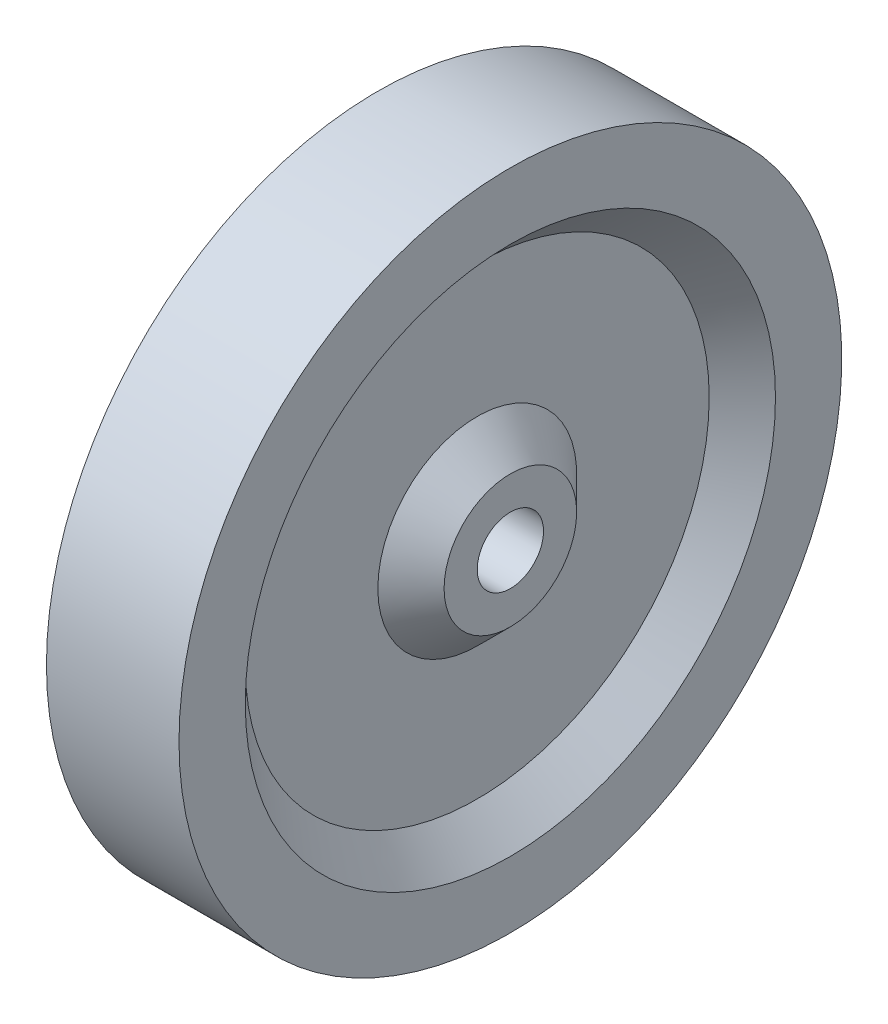
ISO-10303-21;
HEADER;
FILE_DESCRIPTION(('STEP AP214'),'2;1');
FILE_NAME('part.step','',(''),(''),'','','');
FILE_SCHEMA(('AUTOMOTIVE_DESIGN { 1 0 10303 214 1 1 1 1 }'));
ENDSEC;
DATA;
#1=APPLICATION_CONTEXT('core data for automotive mechanical design processes');
#2=APPLICATION_PROTOCOL_DEFINITION('international standard','automotive_design',2000,#1);
#3=PRODUCT_CONTEXT('',#1,'mechanical');
#4=PRODUCT('Part','Part','',(#3));
#5=PRODUCT_RELATED_PRODUCT_CATEGORY('part','',(#4));
#6=PRODUCT_DEFINITION_FORMATION('','',#4);
#7=PRODUCT_DEFINITION_CONTEXT('part definition',#1,'design');
#8=PRODUCT_DEFINITION('design','',#6,#7);
#9=PRODUCT_DEFINITION_SHAPE('','',#8);
#10=(LENGTH_UNIT() NAMED_UNIT(*) SI_UNIT(.MILLI.,.METRE.));
#11=(NAMED_UNIT(*) PLANE_ANGLE_UNIT() SI_UNIT($,.RADIAN.));
#12=(NAMED_UNIT(*) SI_UNIT($,.STERADIAN.) SOLID_ANGLE_UNIT());
#13=UNCERTAINTY_MEASURE_WITH_UNIT(LENGTH_MEASURE(1.E-05),#10,'distance_accuracy_value','');
#14=(GEOMETRIC_REPRESENTATION_CONTEXT(3) GLOBAL_UNCERTAINTY_ASSIGNED_CONTEXT((#13)) GLOBAL_UNIT_ASSIGNED_CONTEXT((#10,
#11,#12)) REPRESENTATION_CONTEXT('',''));
#15=CARTESIAN_POINT('',(0.,0.,0.));
#16=DIRECTION('',(0.,0.,1.));
#17=DIRECTION('',(1.,0.,0.));
#18=AXIS2_PLACEMENT_3D('',#15,#16,#17);
#19=CARTESIAN_POINT('',(-10.,0.,0.));
#20=DIRECTION('',(-1.,0.,0.));
#21=DIRECTION('',(0.,0.,1.));
#22=AXIS2_PLACEMENT_3D('',#19,#20,#21);
#23=CYLINDRICAL_SURFACE('',#22,50.);
#24=CARTESIAN_POINT('',(10.,0.,0.));
#25=DIRECTION('',(-1.,0.,0.));
#26=DIRECTION('',(0.,0.,1.));
#27=AXIS2_PLACEMENT_3D('',#24,#25,#26);
#28=CIRCLE('',#27,50.);
#29=CARTESIAN_POINT('',(10.,0.,50.));
#30=VERTEX_POINT('',#29);
#31=EDGE_CURVE('E67',#30,#30,#28,.T.);
#32=ORIENTED_EDGE('',*,*,#31,.T.);
#33=EDGE_LOOP('',(#32));
#34=FACE_BOUND('',#33,.T.);
#35=CARTESIAN_POINT('',(-10.,0.,0.));
#36=DIRECTION('',(-1.,0.,0.));
#37=DIRECTION('',(0.,0.,1.));
#38=AXIS2_PLACEMENT_3D('',#35,#36,#37);
#39=CIRCLE('',#38,50.);
#40=CARTESIAN_POINT('',(-10.,0.,50.));
#41=VERTEX_POINT('',#40);
#42=EDGE_CURVE('E10',#41,#41,#39,.T.);
#43=ORIENTED_EDGE('',*,*,#42,.F.);
#44=EDGE_LOOP('',(#43));
#45=FACE_BOUND('',#44,.T.);
#46=ADVANCED_FACE('F33',(#34,#45),#23,.T.);
#47=CARTESIAN_POINT('',(-10.,0.,0.));
#48=DIRECTION('',(-1.,0.,0.));
#49=DIRECTION('',(0.,0.,1.));
#50=AXIS2_PLACEMENT_3D('',#47,#48,#49);
#51=PLANE('',#50);
#52=ORIENTED_EDGE('',*,*,#42,.T.);
#53=EDGE_LOOP('',(#52));
#54=FACE_BOUND('',#53,.T.);
#55=CARTESIAN_POINT('',(-10.,0.,0.));
#56=DIRECTION('',(-1.,0.,0.));
#57=DIRECTION('',(0.,0.,1.));
#58=AXIS2_PLACEMENT_3D('',#55,#56,#57);
#59=CIRCLE('',#58,40.);
#60=CARTESIAN_POINT('',(-10.,0.,40.));
#61=VERTEX_POINT('',#60);
#62=EDGE_CURVE('E39',#61,#61,#59,.T.);
#63=ORIENTED_EDGE('',*,*,#62,.F.);
#64=EDGE_LOOP('',(#63));
#65=FACE_BOUND('',#64,.T.);
#66=ADVANCED_FACE('F106',(#54,#65),#51,.T.);
#67=CARTESIAN_POINT('',(-5.,0.,0.));
#68=DIRECTION('',(-1.,0.,0.));
#69=DIRECTION('',(0.,0.,1.));
#70=AXIS2_PLACEMENT_3D('',#67,#68,#69);
#71=CONICAL_SURFACE('',#70,35.,0.785398163397447);
#72=ORIENTED_EDGE('',*,*,#62,.T.);
#73=EDGE_LOOP('',(#72));
#74=FACE_BOUND('',#73,.T.);
#75=CARTESIAN_POINT('',(-5.,0.,0.));
#76=DIRECTION('',(-1.,0.,0.));
#77=DIRECTION('',(0.,0.,1.));
#78=AXIS2_PLACEMENT_3D('',#75,#76,#77);
#79=CIRCLE('',#78,35.);
#80=CARTESIAN_POINT('',(-5.,0.,35.));
#81=VERTEX_POINT('',#80);
#82=EDGE_CURVE('E43',#81,#81,#79,.T.);
#83=ORIENTED_EDGE('',*,*,#82,.F.);
#84=EDGE_LOOP('',(#83));
#85=FACE_BOUND('',#84,.T.);
#86=ADVANCED_FACE('F111',(#74,#85),#71,.F.);
#87=CARTESIAN_POINT('',(-5.,0.,0.));
#88=DIRECTION('',(-1.,0.,0.));
#89=DIRECTION('',(0.,0.,1.));
#90=AXIS2_PLACEMENT_3D('',#87,#88,#89);
#91=PLANE('',#90);
#92=ORIENTED_EDGE('',*,*,#82,.T.);
#93=EDGE_LOOP('',(#92));
#94=FACE_BOUND('',#93,.T.);
#95=CARTESIAN_POINT('',(-5.,0.,0.));
#96=DIRECTION('',(-1.,0.,0.));
#97=DIRECTION('',(0.,0.,1.));
#98=AXIS2_PLACEMENT_3D('',#95,#96,#97);
#99=CIRCLE('',#98,15.);
#100=CARTESIAN_POINT('',(-5.,0.,15.));
#101=VERTEX_POINT('',#100);
#102=EDGE_CURVE('E47',#101,#101,#99,.T.);
#103=ORIENTED_EDGE('',*,*,#102,.F.);
#104=EDGE_LOOP('',(#103));
#105=FACE_BOUND('',#104,.T.);
#106=ADVANCED_FACE('F162',(#94,#105),#91,.T.);
#107=CARTESIAN_POINT('',(-10.,0.,0.));
#108=DIRECTION('',(1.,0.,0.));
#109=DIRECTION('',(0.,0.,-1.));
#110=AXIS2_PLACEMENT_3D('',#107,#108,#109);
#111=CONICAL_SURFACE('',#110,10.,0.785398163397447);
#112=ORIENTED_EDGE('',*,*,#102,.T.);
#113=EDGE_LOOP('',(#112));
#114=FACE_BOUND('',#113,.T.);
#115=CARTESIAN_POINT('',(-10.,0.,0.));
#116=DIRECTION('',(-1.,0.,0.));
#117=DIRECTION('',(0.,0.,1.));
#118=AXIS2_PLACEMENT_3D('',#115,#116,#117);
#119=CIRCLE('',#118,10.);
#120=CARTESIAN_POINT('',(-10.,0.,10.));
#121=VERTEX_POINT('',#120);
#122=EDGE_CURVE('E52',#121,#121,#119,.T.);
#123=ORIENTED_EDGE('',*,*,#122,.F.);
#124=EDGE_LOOP('',(#123));
#125=FACE_BOUND('',#124,.T.);
#126=ADVANCED_FACE('F152',(#114,#125),#111,.T.);
#127=CARTESIAN_POINT('',(-10.,0.,0.));
#128=DIRECTION('',(-1.,0.,0.));
#129=DIRECTION('',(0.,0.,1.));
#130=AXIS2_PLACEMENT_3D('',#127,#128,#129);
#131=PLANE('',#130);
#132=CARTESIAN_POINT('',(-10.,0.,0.));
#133=DIRECTION('',(1.,0.,0.));
#134=DIRECTION('',(0.,0.,-1.));
#135=AXIS2_PLACEMENT_3D('',#132,#133,#134);
#136=CIRCLE('',#135,5.);
#137=CARTESIAN_POINT('',(-10.,0.,-5.));
#138=VERTEX_POINT('',#137);
#139=EDGE_CURVE('E70',#138,#138,#136,.T.);
#140=ORIENTED_EDGE('',*,*,#139,.T.);
#141=EDGE_LOOP('',(#140));
#142=FACE_BOUND('',#141,.T.);
#143=ORIENTED_EDGE('',*,*,#122,.T.);
#144=EDGE_LOOP('',(#143));
#145=FACE_BOUND('',#144,.T.);
#146=ADVANCED_FACE('F77',(#142,#145),#131,.T.);
#147=CARTESIAN_POINT('',(10.,0.,0.));
#148=DIRECTION('',(-1.,0.,0.));
#149=DIRECTION('',(0.,0.,1.));
#150=AXIS2_PLACEMENT_3D('',#147,#148,#149);
#151=PLANE('',#150);
#152=CARTESIAN_POINT('',(10.,0.,0.));
#153=DIRECTION('',(1.,0.,0.));
#154=DIRECTION('',(0.,0.,-1.));
#155=AXIS2_PLACEMENT_3D('',#152,#153,#154);
#156=CIRCLE('',#155,5.);
#157=CARTESIAN_POINT('',(10.,0.,-5.));
#158=VERTEX_POINT('',#157);
#159=EDGE_CURVE('E71',#158,#158,#156,.T.);
#160=ORIENTED_EDGE('',*,*,#159,.F.);
#161=EDGE_LOOP('',(#160));
#162=FACE_BOUND('',#161,.T.);
#163=CARTESIAN_POINT('',(10.,0.,0.));
#164=DIRECTION('',(-1.,0.,0.));
#165=DIRECTION('',(0.,0.,1.));
#166=AXIS2_PLACEMENT_3D('',#163,#164,#165);
#167=CIRCLE('',#166,10.);
#168=CARTESIAN_POINT('',(10.,0.,10.));
#169=VERTEX_POINT('',#168);
#170=EDGE_CURVE('E55',#169,#169,#167,.T.);
#171=ORIENTED_EDGE('',*,*,#170,.F.);
#172=EDGE_LOOP('',(#171));
#173=FACE_BOUND('',#172,.T.);
#174=ADVANCED_FACE('F87',(#162,#173),#151,.F.);
#175=CARTESIAN_POINT('',(10.,0.,0.));
#176=DIRECTION('',(-1.,0.,0.));
#177=DIRECTION('',(0.,0.,1.));
#178=AXIS2_PLACEMENT_3D('',#175,#176,#177);
#179=CONICAL_SURFACE('',#178,10.,0.785398163397446);
#180=CARTESIAN_POINT('',(5.,0.,0.));
#181=DIRECTION('',(-1.,0.,0.));
#182=DIRECTION('',(0.,0.,1.));
#183=AXIS2_PLACEMENT_3D('',#180,#181,#182);
#184=CIRCLE('',#183,15.);
#185=CARTESIAN_POINT('',(5.,0.,15.));
#186=VERTEX_POINT('',#185);
#187=EDGE_CURVE('E58',#186,#186,#184,.T.);
#188=ORIENTED_EDGE('',*,*,#187,.F.);
#189=EDGE_LOOP('',(#188));
#190=FACE_BOUND('',#189,.T.);
#191=ORIENTED_EDGE('',*,*,#170,.T.);
#192=EDGE_LOOP('',(#191));
#193=FACE_BOUND('',#192,.T.);
#194=ADVANCED_FACE('F90',(#190,#193),#179,.T.);
#195=CARTESIAN_POINT('',(5.,0.,0.));
#196=DIRECTION('',(-1.,0.,0.));
#197=DIRECTION('',(0.,0.,1.));
#198=AXIS2_PLACEMENT_3D('',#195,#196,#197);
#199=PLANE('',#198);
#200=CARTESIAN_POINT('',(5.,0.,0.));
#201=DIRECTION('',(-1.,0.,0.));
#202=DIRECTION('',(0.,0.,1.));
#203=AXIS2_PLACEMENT_3D('',#200,#201,#202);
#204=CIRCLE('',#203,35.);
#205=CARTESIAN_POINT('',(5.,0.,35.));
#206=VERTEX_POINT('',#205);
#207=EDGE_CURVE('E61',#206,#206,#204,.T.);
#208=ORIENTED_EDGE('',*,*,#207,.F.);
#209=EDGE_LOOP('',(#208));
#210=FACE_BOUND('',#209,.T.);
#211=ORIENTED_EDGE('',*,*,#187,.T.);
#212=EDGE_LOOP('',(#211));
#213=FACE_BOUND('',#212,.T.);
#214=ADVANCED_FACE('F95',(#210,#213),#199,.F.);
#215=CARTESIAN_POINT('',(5.,0.,0.));
#216=DIRECTION('',(1.,0.,0.));
#217=DIRECTION('',(0.,0.,-1.));
#218=AXIS2_PLACEMENT_3D('',#215,#216,#217);
#219=CONICAL_SURFACE('',#218,35.,0.785398163397447);
#220=CARTESIAN_POINT('',(10.,0.,0.));
#221=DIRECTION('',(-1.,0.,0.));
#222=DIRECTION('',(0.,0.,1.));
#223=AXIS2_PLACEMENT_3D('',#220,#221,#222);
#224=CIRCLE('',#223,40.);
#225=CARTESIAN_POINT('',(10.,0.,40.));
#226=VERTEX_POINT('',#225);
#227=EDGE_CURVE('E64',#226,#226,#224,.T.);
#228=ORIENTED_EDGE('',*,*,#227,.F.);
#229=EDGE_LOOP('',(#228));
#230=FACE_BOUND('',#229,.T.);
#231=ORIENTED_EDGE('',*,*,#207,.T.);
#232=EDGE_LOOP('',(#231));
#233=FACE_BOUND('',#232,.T.);
#234=ADVANCED_FACE('F101',(#230,#233),#219,.F.);
#235=CARTESIAN_POINT('',(10.,0.,0.));
#236=DIRECTION('',(-1.,0.,0.));
#237=DIRECTION('',(0.,0.,1.));
#238=AXIS2_PLACEMENT_3D('',#235,#236,#237);
#239=PLANE('',#238);
#240=ORIENTED_EDGE('',*,*,#31,.F.);
#241=EDGE_LOOP('',(#240));
#242=FACE_BOUND('',#241,.T.);
#243=ORIENTED_EDGE('',*,*,#227,.T.);
#244=EDGE_LOOP('',(#243));
#245=FACE_BOUND('',#244,.T.);
#246=ADVANCED_FACE('F83',(#242,#245),#239,.F.);
#247=CARTESIAN_POINT('',(-10.,0.,0.));
#248=DIRECTION('',(1.,0.,0.));
#249=DIRECTION('',(0.,0.,-1.));
#250=AXIS2_PLACEMENT_3D('',#247,#248,#249);
#251=CYLINDRICAL_SURFACE('',#250,5.);
#252=ORIENTED_EDGE('',*,*,#139,.F.);
#253=EDGE_LOOP('',(#252));
#254=FACE_BOUND('',#253,.T.);
#255=ORIENTED_EDGE('',*,*,#159,.T.);
#256=EDGE_LOOP('',(#255));
#257=FACE_BOUND('',#256,.T.);
#258=ADVANCED_FACE('F80',(#254,#257),#251,.F.);
#259=CLOSED_SHELL('',(#46,#66,#86,#106,#126,#146,#174,#194,#214,#234,#246,#258));
#260=MANIFOLD_SOLID_BREP('B2',#259);
#261=ADVANCED_BREP_SHAPE_REPRESENTATION('',(#18,#260),#14);
#262=SHAPE_DEFINITION_REPRESENTATION(#9,#261);
ENDSEC;
END-ISO-10303-21;
